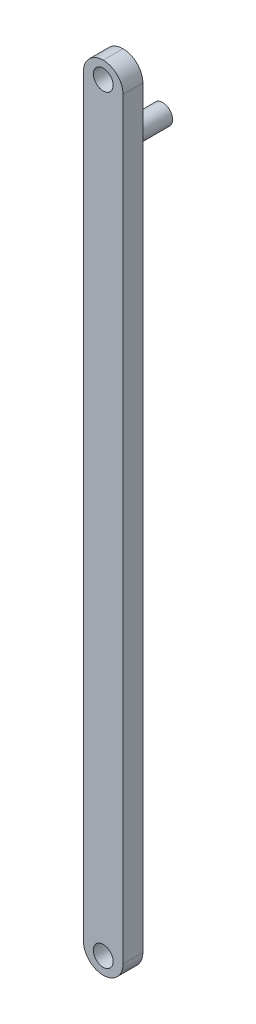
ISO-10303-21;
HEADER;
FILE_DESCRIPTION(('STEP AP214'),'2;1');
FILE_NAME('part.step','',(''),(''),'','','');
FILE_SCHEMA(('AUTOMOTIVE_DESIGN { 1 0 10303 214 1 1 1 1 }'));
ENDSEC;
DATA;
#1=APPLICATION_CONTEXT('core data for automotive mechanical design processes');
#2=APPLICATION_PROTOCOL_DEFINITION('international standard','automotive_design',2000,#1);
#3=PRODUCT_CONTEXT('',#1,'mechanical');
#4=PRODUCT('Part','Part','',(#3));
#5=PRODUCT_RELATED_PRODUCT_CATEGORY('part','',(#4));
#6=PRODUCT_DEFINITION_FORMATION('','',#4);
#7=PRODUCT_DEFINITION_CONTEXT('part definition',#1,'design');
#8=PRODUCT_DEFINITION('design','',#6,#7);
#9=PRODUCT_DEFINITION_SHAPE('','',#8);
#10=(LENGTH_UNIT() NAMED_UNIT(*) SI_UNIT(.MILLI.,.METRE.));
#11=(NAMED_UNIT(*) PLANE_ANGLE_UNIT() SI_UNIT($,.RADIAN.));
#12=(NAMED_UNIT(*) SI_UNIT($,.STERADIAN.) SOLID_ANGLE_UNIT());
#13=UNCERTAINTY_MEASURE_WITH_UNIT(LENGTH_MEASURE(1.E-05),#10,'distance_accuracy_value','');
#14=(GEOMETRIC_REPRESENTATION_CONTEXT(3) GLOBAL_UNCERTAINTY_ASSIGNED_CONTEXT((#13)) GLOBAL_UNIT_ASSIGNED_CONTEXT((#10,
#11,#12)) REPRESENTATION_CONTEXT('',''));
#15=CARTESIAN_POINT('',(0.,0.,0.));
#16=DIRECTION('',(0.,0.,1.));
#17=DIRECTION('',(1.,0.,0.));
#18=AXIS2_PLACEMENT_3D('',#15,#16,#17);
#19=CARTESIAN_POINT('',(0.,0.,0.));
#20=DIRECTION('',(0.,0.,-1.));
#21=DIRECTION('',(-1.,0.,0.));
#22=AXIS2_PLACEMENT_3D('',#19,#20,#21);
#23=PLANE('',#22);
#24=CARTESIAN_POINT('',(0.,-191.5,0.));
#25=DIRECTION('',(0.,0.,-1.));
#26=DIRECTION('',(1.,0.,0.));
#27=AXIS2_PLACEMENT_3D('',#24,#25,#26);
#28=CIRCLE('',#27,5.);
#29=CARTESIAN_POINT('',(5.,-191.5,0.));
#30=VERTEX_POINT('',#29);
#31=EDGE_CURVE('E212',#30,#30,#28,.T.);
#32=ORIENTED_EDGE('',*,*,#31,.F.);
#33=EDGE_LOOP('',(#32));
#34=FACE_BOUND('',#33,.T.);
#35=DIRECTION('',(0.,-1.,0.));
#36=VECTOR('',#35,1.);
#37=CARTESIAN_POINT('',(-10.,-200.,0.));
#38=LINE('',#37,#36);
#39=CARTESIAN_POINT('',(-10.,161.5,0.));
#40=VERTEX_POINT('',#39);
#41=CARTESIAN_POINT('',(-10.,-190.,0.));
#42=VERTEX_POINT('',#41);
#43=EDGE_CURVE('E107',#40,#42,#38,.T.);
#44=ORIENTED_EDGE('',*,*,#43,.F.);
#45=CARTESIAN_POINT('',(0.,161.5,0.));
#46=DIRECTION('',(0.,0.,-1.));
#47=DIRECTION('',(-1.,0.,0.));
#48=AXIS2_PLACEMENT_3D('',#45,#46,#47);
#49=CIRCLE('',#48,10.);
#50=CARTESIAN_POINT('',(10.,161.5,0.));
#51=VERTEX_POINT('',#50);
#52=EDGE_CURVE('E11',#40,#51,#49,.F.);
#53=ORIENTED_EDGE('',*,*,#52,.T.);
#54=DIRECTION('',(0.,1.,0.));
#55=VECTOR('',#54,1.);
#56=CARTESIAN_POINT('',(10.,-200.,0.));
#57=LINE('',#56,#55);
#58=CARTESIAN_POINT('',(10.,-190.,0.));
#59=VERTEX_POINT('',#58);
#60=EDGE_CURVE('E94',#59,#51,#57,.T.);
#61=ORIENTED_EDGE('',*,*,#60,.F.);
#62=CARTESIAN_POINT('',(0.,-190.,0.));
#63=DIRECTION('',(0.,0.,-1.));
#64=DIRECTION('',(-1.,0.,0.));
#65=AXIS2_PLACEMENT_3D('',#62,#63,#64);
#66=CIRCLE('',#65,10.);
#67=CARTESIAN_POINT('',(0.,-200.,0.));
#68=VERTEX_POINT('',#67);
#69=EDGE_CURVE('E105',#59,#68,#66,.T.);
#70=ORIENTED_EDGE('',*,*,#69,.T.);
#71=CARTESIAN_POINT('',(0.,-190.,0.));
#72=DIRECTION('',(0.,0.,-1.));
#73=DIRECTION('',(-1.,0.,0.));
#74=AXIS2_PLACEMENT_3D('',#71,#72,#73);
#75=CIRCLE('',#74,10.);
#76=EDGE_CURVE('E114',#68,#42,#75,.T.);
#77=ORIENTED_EDGE('',*,*,#76,.T.);
#78=EDGE_LOOP('',(#44,#53,#61,#70,#77));
#79=FACE_BOUND('',#78,.T.);
#80=ADVANCED_FACE('F33',(#34,#79),#23,.T.);
#81=CARTESIAN_POINT('',(0.,191.5,0.));
#82=DIRECTION('',(0.,0.,1.));
#83=DIRECTION('',(1.,0.,0.));
#84=AXIS2_PLACEMENT_3D('',#81,#82,#83);
#85=CIRCLE('',#84,5.);
#86=CARTESIAN_POINT('',(5.,191.5,0.));
#87=VERTEX_POINT('',#86);
#88=EDGE_CURVE('E141',#87,#87,#85,.T.);
#89=ORIENTED_EDGE('',*,*,#88,.T.);
#90=EDGE_LOOP('',(#89));
#91=FACE_BOUND('',#90,.T.);
#92=CARTESIAN_POINT('',(10.,190.,0.));
#93=VERTEX_POINT('',#92);
#94=EDGE_CURVE('E108',#51,#93,#57,.T.);
#95=ORIENTED_EDGE('',*,*,#94,.F.);
#96=CARTESIAN_POINT('',(0.,161.5,0.));
#97=DIRECTION('',(0.,0.,-1.));
#98=DIRECTION('',(-1.,0.,0.));
#99=AXIS2_PLACEMENT_3D('',#96,#97,#98);
#100=CIRCLE('',#99,10.);
#101=EDGE_CURVE('E41',#51,#40,#100,.F.);
#102=ORIENTED_EDGE('',*,*,#101,.T.);
#103=CARTESIAN_POINT('',(-10.,190.,0.));
#104=VERTEX_POINT('',#103);
#105=EDGE_CURVE('E205',#104,#40,#38,.T.);
#106=ORIENTED_EDGE('',*,*,#105,.F.);
#107=CARTESIAN_POINT('',(0.,190.,0.));
#108=DIRECTION('',(0.,0.,-1.));
#109=DIRECTION('',(-1.,0.,0.));
#110=AXIS2_PLACEMENT_3D('',#107,#108,#109);
#111=CIRCLE('',#110,10.);
#112=CARTESIAN_POINT('',(0.,200.,0.));
#113=VERTEX_POINT('',#112);
#114=EDGE_CURVE('E115',#104,#113,#111,.T.);
#115=ORIENTED_EDGE('',*,*,#114,.T.);
#116=CARTESIAN_POINT('',(0.,190.,0.));
#117=DIRECTION('',(0.,0.,-1.));
#118=DIRECTION('',(-1.,0.,0.));
#119=AXIS2_PLACEMENT_3D('',#116,#117,#118);
#120=CIRCLE('',#119,10.);
#121=EDGE_CURVE('E119',#113,#93,#120,.T.);
#122=ORIENTED_EDGE('',*,*,#121,.T.);
#123=EDGE_LOOP('',(#95,#102,#106,#115,#122));
#124=FACE_BOUND('',#123,.T.);
#125=ADVANCED_FACE('F156',(#91,#124),#23,.T.);
#126=CARTESIAN_POINT('',(0.,0.,10.));
#127=DIRECTION('',(0.,0.,-1.));
#128=DIRECTION('',(-1.,0.,0.));
#129=AXIS2_PLACEMENT_3D('',#126,#127,#128);
#130=PLANE('',#129);
#131=DIRECTION('',(0.,-1.,0.));
#132=VECTOR('',#131,1.);
#133=CARTESIAN_POINT('',(-10.,-200.,10.));
#134=LINE('',#133,#132);
#135=CARTESIAN_POINT('',(-10.,190.,10.));
#136=VERTEX_POINT('',#135);
#137=CARTESIAN_POINT('',(-10.,-190.,10.));
#138=VERTEX_POINT('',#137);
#139=EDGE_CURVE('E201',#136,#138,#134,.T.);
#140=ORIENTED_EDGE('',*,*,#139,.T.);
#141=CARTESIAN_POINT('',(0.,-190.,10.));
#142=DIRECTION('',(0.,0.,-1.));
#143=DIRECTION('',(-1.,0.,0.));
#144=AXIS2_PLACEMENT_3D('',#141,#142,#143);
#145=CIRCLE('',#144,10.);
#146=CARTESIAN_POINT('',(0.,-200.,10.));
#147=VERTEX_POINT('',#146);
#148=EDGE_CURVE('E134',#138,#147,#145,.F.);
#149=ORIENTED_EDGE('',*,*,#148,.T.);
#150=CARTESIAN_POINT('',(0.,-190.,10.));
#151=DIRECTION('',(0.,0.,-1.));
#152=DIRECTION('',(-1.,0.,0.));
#153=AXIS2_PLACEMENT_3D('',#150,#151,#152);
#154=CIRCLE('',#153,10.);
#155=CARTESIAN_POINT('',(10.,-190.,10.));
#156=VERTEX_POINT('',#155);
#157=EDGE_CURVE('E132',#147,#156,#154,.F.);
#158=ORIENTED_EDGE('',*,*,#157,.T.);
#159=DIRECTION('',(0.,1.,0.));
#160=VECTOR('',#159,1.);
#161=CARTESIAN_POINT('',(10.,-200.,10.));
#162=LINE('',#161,#160);
#163=CARTESIAN_POINT('',(10.,190.,10.));
#164=VERTEX_POINT('',#163);
#165=EDGE_CURVE('E96',#156,#164,#162,.T.);
#166=ORIENTED_EDGE('',*,*,#165,.T.);
#167=CARTESIAN_POINT('',(0.,190.,10.));
#168=DIRECTION('',(0.,0.,-1.));
#169=DIRECTION('',(-1.,0.,0.));
#170=AXIS2_PLACEMENT_3D('',#167,#168,#169);
#171=CIRCLE('',#170,10.);
#172=CARTESIAN_POINT('',(0.,200.,10.));
#173=VERTEX_POINT('',#172);
#174=EDGE_CURVE('E128',#164,#173,#171,.F.);
#175=ORIENTED_EDGE('',*,*,#174,.T.);
#176=CARTESIAN_POINT('',(0.,190.,10.));
#177=DIRECTION('',(0.,0.,-1.));
#178=DIRECTION('',(-1.,0.,0.));
#179=AXIS2_PLACEMENT_3D('',#176,#177,#178);
#180=CIRCLE('',#179,10.);
#181=EDGE_CURVE('E130',#173,#136,#180,.F.);
#182=ORIENTED_EDGE('',*,*,#181,.T.);
#183=EDGE_LOOP('',(#140,#149,#158,#166,#175,#182));
#184=FACE_BOUND('',#183,.T.);
#185=CARTESIAN_POINT('',(0.,191.5,10.));
#186=DIRECTION('',(0.,0.,1.));
#187=DIRECTION('',(1.,0.,0.));
#188=AXIS2_PLACEMENT_3D('',#185,#186,#187);
#189=CIRCLE('',#188,5.);
#190=CARTESIAN_POINT('',(5.,191.5,10.));
#191=VERTEX_POINT('',#190);
#192=EDGE_CURVE('E209',#191,#191,#189,.T.);
#193=ORIENTED_EDGE('',*,*,#192,.F.);
#194=EDGE_LOOP('',(#193));
#195=FACE_BOUND('',#194,.T.);
#196=CARTESIAN_POINT('',(0.,-191.5,10.));
#197=DIRECTION('',(0.,0.,-1.));
#198=DIRECTION('',(1.,0.,0.));
#199=AXIS2_PLACEMENT_3D('',#196,#197,#198);
#200=CIRCLE('',#199,5.);
#201=CARTESIAN_POINT('',(5.,-191.5,10.));
#202=VERTEX_POINT('',#201);
#203=EDGE_CURVE('E215',#202,#202,#200,.T.);
#204=ORIENTED_EDGE('',*,*,#203,.T.);
#205=EDGE_LOOP('',(#204));
#206=FACE_BOUND('',#205,.T.);
#207=ADVANCED_FACE('F163',(#184,#195,#206),#130,.F.);
#208=CARTESIAN_POINT('',(10.,-200.,10.));
#209=DIRECTION('',(-1.,0.,0.));
#210=DIRECTION('',(0.,0.,1.));
#211=AXIS2_PLACEMENT_3D('',#208,#209,#210);
#212=PLANE('',#211);
#213=ORIENTED_EDGE('',*,*,#165,.F.);
#214=DIRECTION('',(0.,0.,-1.));
#215=VECTOR('',#214,1.);
#216=CARTESIAN_POINT('',(10.,-190.,10.));
#217=LINE('',#216,#215);
#218=EDGE_CURVE('E91',#156,#59,#217,.T.);
#219=ORIENTED_EDGE('',*,*,#218,.T.);
#220=ORIENTED_EDGE('',*,*,#60,.T.);
#221=ORIENTED_EDGE('',*,*,#94,.T.);
#222=DIRECTION('',(0.,0.,-1.));
#223=VECTOR('',#222,1.);
#224=CARTESIAN_POINT('',(10.,190.,10.));
#225=LINE('',#224,#223);
#226=EDGE_CURVE('E101',#93,#164,#225,.F.);
#227=ORIENTED_EDGE('',*,*,#226,.T.);
#228=EDGE_LOOP('',(#213,#219,#220,#221,#227));
#229=FACE_BOUND('',#228,.T.);
#230=ADVANCED_FACE('F93',(#229),#212,.F.);
#231=CARTESIAN_POINT('',(-10.,-200.,10.));
#232=DIRECTION('',(1.,0.,0.));
#233=DIRECTION('',(0.,0.,-1.));
#234=AXIS2_PLACEMENT_3D('',#231,#232,#233);
#235=PLANE('',#234);
#236=ORIENTED_EDGE('',*,*,#105,.T.);
#237=ORIENTED_EDGE('',*,*,#43,.T.);
#238=DIRECTION('',(0.,0.,-1.));
#239=VECTOR('',#238,1.);
#240=CARTESIAN_POINT('',(-10.,-190.,10.));
#241=LINE('',#240,#239);
#242=EDGE_CURVE('E125',#42,#138,#241,.F.);
#243=ORIENTED_EDGE('',*,*,#242,.T.);
#244=ORIENTED_EDGE('',*,*,#139,.F.);
#245=DIRECTION('',(0.,0.,-1.));
#246=VECTOR('',#245,1.);
#247=CARTESIAN_POINT('',(-10.,190.,10.));
#248=LINE('',#247,#246);
#249=EDGE_CURVE('E117',#136,#104,#248,.T.);
#250=ORIENTED_EDGE('',*,*,#249,.T.);
#251=EDGE_LOOP('',(#236,#237,#243,#244,#250));
#252=FACE_BOUND('',#251,.T.);
#253=ADVANCED_FACE('F169',(#252),#235,.F.);
#254=CARTESIAN_POINT('',(0.,-190.,10.));
#255=DIRECTION('',(0.,0.,-1.));
#256=DIRECTION('',(-1.,0.,0.));
#257=AXIS2_PLACEMENT_3D('',#254,#255,#256);
#258=CYLINDRICAL_SURFACE('',#257,10.);
#259=ORIENTED_EDGE('',*,*,#218,.F.);
#260=ORIENTED_EDGE('',*,*,#157,.F.);
#261=DIRECTION('',(0.,0.,-1.));
#262=VECTOR('',#261,1.);
#263=CARTESIAN_POINT('',(0.,-200.,10.));
#264=LINE('',#263,#262);
#265=EDGE_CURVE('E112',#68,#147,#264,.F.);
#266=ORIENTED_EDGE('',*,*,#265,.F.);
#267=ORIENTED_EDGE('',*,*,#69,.F.);
#268=EDGE_LOOP('',(#259,#260,#266,#267));
#269=FACE_BOUND('',#268,.T.);
#270=ADVANCED_FACE('F110',(#269),#258,.T.);
#271=CARTESIAN_POINT('',(0.,-190.,10.));
#272=DIRECTION('',(0.,0.,-1.));
#273=DIRECTION('',(-1.,0.,0.));
#274=AXIS2_PLACEMENT_3D('',#271,#272,#273);
#275=CYLINDRICAL_SURFACE('',#274,10.);
#276=ORIENTED_EDGE('',*,*,#148,.F.);
#277=ORIENTED_EDGE('',*,*,#242,.F.);
#278=ORIENTED_EDGE('',*,*,#76,.F.);
#279=ORIENTED_EDGE('',*,*,#265,.T.);
#280=EDGE_LOOP('',(#276,#277,#278,#279));
#281=FACE_BOUND('',#280,.T.);
#282=ADVANCED_FACE('F175',(#281),#275,.T.);
#283=CARTESIAN_POINT('',(0.,190.,10.));
#284=DIRECTION('',(0.,0.,-1.));
#285=DIRECTION('',(-1.,0.,0.));
#286=AXIS2_PLACEMENT_3D('',#283,#284,#285);
#287=CYLINDRICAL_SURFACE('',#286,10.);
#288=DIRECTION('',(0.,0.,-1.));
#289=VECTOR('',#288,1.);
#290=CARTESIAN_POINT('',(0.,200.,10.));
#291=LINE('',#290,#289);
#292=EDGE_CURVE('E138',#173,#113,#291,.T.);
#293=ORIENTED_EDGE('',*,*,#292,.F.);
#294=ORIENTED_EDGE('',*,*,#174,.F.);
#295=ORIENTED_EDGE('',*,*,#226,.F.);
#296=ORIENTED_EDGE('',*,*,#121,.F.);
#297=EDGE_LOOP('',(#293,#294,#295,#296));
#298=FACE_BOUND('',#297,.T.);
#299=ADVANCED_FACE('F178',(#298),#287,.T.);
#300=CARTESIAN_POINT('',(0.,190.,10.));
#301=DIRECTION('',(0.,0.,-1.));
#302=DIRECTION('',(-1.,0.,0.));
#303=AXIS2_PLACEMENT_3D('',#300,#301,#302);
#304=CYLINDRICAL_SURFACE('',#303,10.);
#305=ORIENTED_EDGE('',*,*,#181,.F.);
#306=ORIENTED_EDGE('',*,*,#292,.T.);
#307=ORIENTED_EDGE('',*,*,#114,.F.);
#308=ORIENTED_EDGE('',*,*,#249,.F.);
#309=EDGE_LOOP('',(#305,#306,#307,#308));
#310=FACE_BOUND('',#309,.T.);
#311=ADVANCED_FACE('F182',(#310),#304,.T.);
#312=CARTESIAN_POINT('',(0.,191.5,0.));
#313=DIRECTION('',(0.,0.,1.));
#314=DIRECTION('',(1.,0.,0.));
#315=AXIS2_PLACEMENT_3D('',#312,#313,#314);
#316=CYLINDRICAL_SURFACE('',#315,5.);
#317=ORIENTED_EDGE('',*,*,#88,.F.);
#318=EDGE_LOOP('',(#317));
#319=FACE_BOUND('',#318,.T.);
#320=ORIENTED_EDGE('',*,*,#192,.T.);
#321=EDGE_LOOP('',(#320));
#322=FACE_BOUND('',#321,.T.);
#323=ADVANCED_FACE('F184',(#319,#322),#316,.F.);
#324=CARTESIAN_POINT('',(0.,-191.5,0.));
#325=DIRECTION('',(0.,0.,1.));
#326=DIRECTION('',(1.,0.,0.));
#327=AXIS2_PLACEMENT_3D('',#324,#325,#326);
#328=CYLINDRICAL_SURFACE('',#327,5.);
#329=ORIENTED_EDGE('',*,*,#31,.T.);
#330=EDGE_LOOP('',(#329));
#331=FACE_BOUND('',#330,.T.);
#332=ORIENTED_EDGE('',*,*,#203,.F.);
#333=EDGE_LOOP('',(#332));
#334=FACE_BOUND('',#333,.T.);
#335=ADVANCED_FACE('F224',(#331,#334),#328,.F.);
#336=CARTESIAN_POINT('',(0.,161.5,-20.));
#337=DIRECTION('',(0.,0.,1.));
#338=DIRECTION('',(1.,0.,0.));
#339=AXIS2_PLACEMENT_3D('',#336,#337,#338);
#340=CYLINDRICAL_SURFACE('',#339,5.);
#341=CARTESIAN_POINT('',(0.,161.5,-5.));
#342=DIRECTION('',(0.,0.,-1.));
#343=DIRECTION('',(-1.,0.,0.));
#344=AXIS2_PLACEMENT_3D('',#341,#342,#343);
#345=CIRCLE('',#344,5.);
#346=CARTESIAN_POINT('',(-5.,161.5,-5.));
#347=VERTEX_POINT('',#346);
#348=EDGE_CURVE('E100',#347,#347,#345,.T.);
#349=ORIENTED_EDGE('',*,*,#348,.T.);
#350=EDGE_LOOP('',(#349));
#351=FACE_BOUND('',#350,.T.);
#352=CARTESIAN_POINT('',(0.,161.5,-20.));
#353=DIRECTION('',(0.,0.,-1.));
#354=DIRECTION('',(-1.,0.,0.));
#355=AXIS2_PLACEMENT_3D('',#352,#353,#354);
#356=CIRCLE('',#355,5.);
#357=CARTESIAN_POINT('',(-5.,161.5,-20.));
#358=VERTEX_POINT('',#357);
#359=EDGE_CURVE('E218',#358,#358,#356,.T.);
#360=ORIENTED_EDGE('',*,*,#359,.F.);
#361=EDGE_LOOP('',(#360));
#362=FACE_BOUND('',#361,.T.);
#363=ADVANCED_FACE('F145',(#351,#362),#340,.T.);
#364=CARTESIAN_POINT('',(0.,161.5,-20.));
#365=DIRECTION('',(0.,0.,-1.));
#366=DIRECTION('',(-1.,0.,0.));
#367=AXIS2_PLACEMENT_3D('',#364,#365,#366);
#368=PLANE('',#367);
#369=ORIENTED_EDGE('',*,*,#359,.T.);
#370=EDGE_LOOP('',(#369));
#371=FACE_BOUND('',#370,.T.);
#372=ADVANCED_FACE('F149',(#371),#368,.T.);
#373=CARTESIAN_POINT('',(0.,161.5,-5.));
#374=DIRECTION('',(0.,0.,-1.));
#375=DIRECTION('',(-1.,0.,0.));
#376=AXIS2_PLACEMENT_3D('',#373,#374,#375);
#377=TOROIDAL_SURFACE('',#376,10.,5.);
#378=ORIENTED_EDGE('',*,*,#101,.F.);
#379=ORIENTED_EDGE('',*,*,#52,.F.);
#380=EDGE_LOOP('',(#378,#379));
#381=FACE_BOUND('',#380,.T.);
#382=ORIENTED_EDGE('',*,*,#348,.F.);
#383=EDGE_LOOP('',(#382));
#384=FACE_BOUND('',#383,.T.);
#385=ADVANCED_FACE('F35',(#381,#384),#377,.F.);
#386=CLOSED_SHELL('',(#80,#125,#207,#230,#253,#270,#282,#299,#311,#323,#335,#363,#372,#385));
#387=MANIFOLD_SOLID_BREP('B2',#386);
#388=ADVANCED_BREP_SHAPE_REPRESENTATION('',(#18,#387),#14);
#389=SHAPE_DEFINITION_REPRESENTATION(#9,#388);
ENDSEC;
END-ISO-10303-21;
